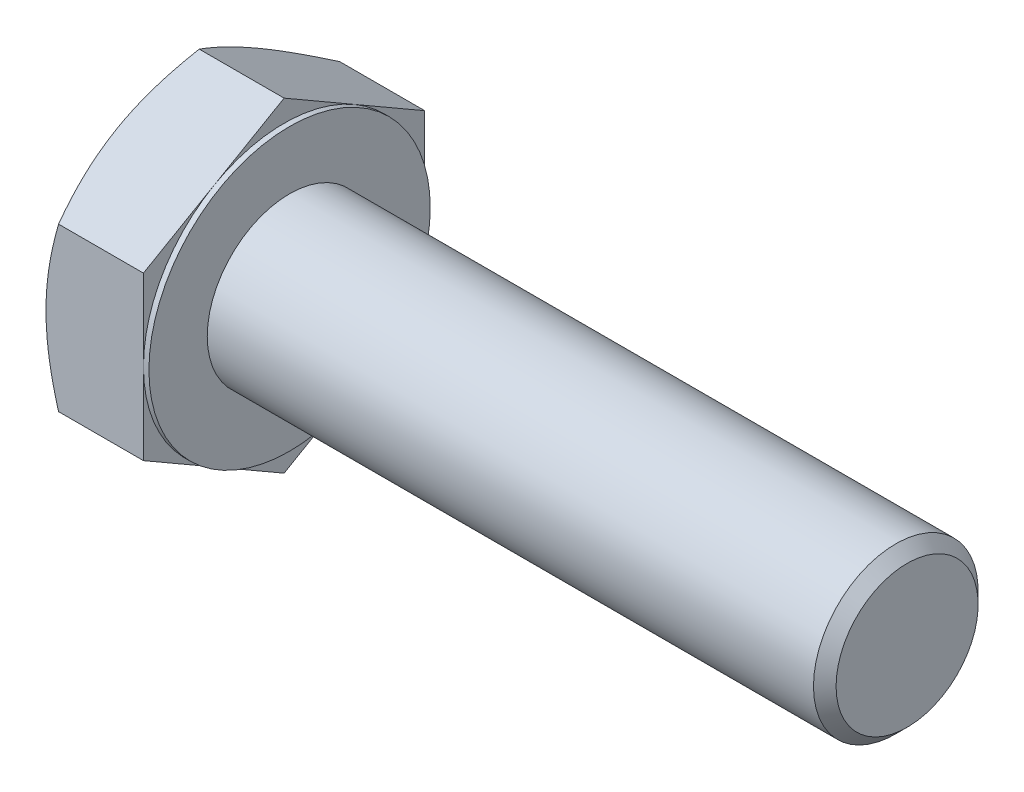
ISO-10303-21;
HEADER;
FILE_DESCRIPTION(('STEP AP214'),'2;1');
FILE_NAME('part.step','',(''),(''),'','','');
FILE_SCHEMA(('AUTOMOTIVE_DESIGN { 1 0 10303 214 1 1 1 1 }'));
ENDSEC;
DATA;
#1=APPLICATION_CONTEXT('core data for automotive mechanical design processes');
#2=APPLICATION_PROTOCOL_DEFINITION('international standard','automotive_design',2000,#1);
#3=PRODUCT_CONTEXT('',#1,'mechanical');
#4=PRODUCT('Part','Part','',(#3));
#5=PRODUCT_RELATED_PRODUCT_CATEGORY('part','',(#4));
#6=PRODUCT_DEFINITION_FORMATION('','',#4);
#7=PRODUCT_DEFINITION_CONTEXT('part definition',#1,'design');
#8=PRODUCT_DEFINITION('design','',#6,#7);
#9=PRODUCT_DEFINITION_SHAPE('','',#8);
#10=(LENGTH_UNIT() NAMED_UNIT(*) SI_UNIT(.MILLI.,.METRE.));
#11=(NAMED_UNIT(*) PLANE_ANGLE_UNIT() SI_UNIT($,.RADIAN.));
#12=(NAMED_UNIT(*) SI_UNIT($,.STERADIAN.) SOLID_ANGLE_UNIT());
#13=UNCERTAINTY_MEASURE_WITH_UNIT(LENGTH_MEASURE(1.E-05),#10,'distance_accuracy_value','');
#14=(GEOMETRIC_REPRESENTATION_CONTEXT(3) GLOBAL_UNCERTAINTY_ASSIGNED_CONTEXT((#13)) GLOBAL_UNIT_ASSIGNED_CONTEXT((#10,
#11,#12)) REPRESENTATION_CONTEXT('',''));
#15=CARTESIAN_POINT('',(0.,0.,0.));
#16=DIRECTION('',(0.,0.,1.));
#17=DIRECTION('',(1.,0.,0.));
#18=AXIS2_PLACEMENT_3D('',#15,#16,#17);
#19=CARTESIAN_POINT('',(15.,23.6713610367747,0.));
#20=DIRECTION('',(1.,0.,0.));
#21=DIRECTION('',(0.,0.,-1.));
#22=AXIS2_PLACEMENT_3D('',#19,#20,#21);
#23=PLANE('',#22);
#24=CARTESIAN_POINT('',(15.,0.,0.));
#25=DIRECTION('',(1.,0.,0.));
#26=DIRECTION('',(0.,0.,-1.));
#27=AXIS2_PLACEMENT_3D('',#24,#25,#26);
#28=CIRCLE('',#27,12.);
#29=CARTESIAN_POINT('',(15.,0.,-12.));
#30=VERTEX_POINT('',#29);
#31=EDGE_CURVE('E272',#30,#30,#28,.F.);
#32=ORIENTED_EDGE('',*,*,#31,.T.);
#33=EDGE_LOOP('',(#32));
#34=FACE_BOUND('',#33,.T.);
#35=CARTESIAN_POINT('',(15.,0.,0.));
#36=DIRECTION('',(1.,0.,0.));
#37=DIRECTION('',(0.,0.,-1.));
#38=AXIS2_PLACEMENT_3D('',#35,#36,#37);
#39=CIRCLE('',#38,20.5);
#40=CARTESIAN_POINT('',(15.,0.,-20.5));
#41=VERTEX_POINT('',#40);
#42=EDGE_CURVE('E291',#41,#41,#39,.T.);
#43=ORIENTED_EDGE('',*,*,#42,.T.);
#44=EDGE_LOOP('',(#43));
#45=FACE_BOUND('',#44,.T.);
#46=ADVANCED_FACE('F34',(#34,#45),#23,.T.);
#47=CARTESIAN_POINT('',(0.,0.,0.));
#48=DIRECTION('',(-1.,0.,0.));
#49=DIRECTION('',(0.,0.,1.));
#50=AXIS2_PLACEMENT_3D('',#47,#48,#49);
#51=CYLINDRICAL_SURFACE('',#50,12.);
#52=ORIENTED_EDGE('',*,*,#31,.F.);
#53=EDGE_LOOP('',(#52));
#54=FACE_BOUND('',#53,.T.);
#55=CARTESIAN_POINT('',(103.352,0.,0.));
#56=DIRECTION('',(-1.,0.,0.));
#57=DIRECTION('',(0.,0.,1.));
#58=AXIS2_PLACEMENT_3D('',#55,#56,#57);
#59=CIRCLE('',#58,12.);
#60=CARTESIAN_POINT('',(103.352,0.,12.));
#61=VERTEX_POINT('',#60);
#62=EDGE_CURVE('E269',#61,#61,#59,.T.);
#63=ORIENTED_EDGE('',*,*,#62,.T.);
#64=EDGE_LOOP('',(#63));
#65=FACE_BOUND('',#64,.T.);
#66=ADVANCED_FACE('F243',(#54,#65),#51,.T.);
#67=CARTESIAN_POINT('',(105.,0.,0.));
#68=DIRECTION('',(-1.,0.,0.));
#69=DIRECTION('',(0.,0.,1.));
#70=AXIS2_PLACEMENT_3D('',#67,#68,#69);
#71=CONICAL_SURFACE('',#70,10.352,0.785398163397449);
#72=ORIENTED_EDGE('',*,*,#62,.F.);
#73=EDGE_LOOP('',(#72));
#74=FACE_BOUND('',#73,.T.);
#75=CARTESIAN_POINT('',(105.,0.,0.));
#76=DIRECTION('',(-1.,0.,0.));
#77=DIRECTION('',(0.,0.,1.));
#78=AXIS2_PLACEMENT_3D('',#75,#76,#77);
#79=CIRCLE('',#78,10.352);
#80=CARTESIAN_POINT('',(105.,0.,10.352));
#81=VERTEX_POINT('',#80);
#82=EDGE_CURVE('E267',#81,#81,#79,.T.);
#83=ORIENTED_EDGE('',*,*,#82,.T.);
#84=EDGE_LOOP('',(#83));
#85=FACE_BOUND('',#84,.T.);
#86=ADVANCED_FACE('F248',(#74,#85),#71,.T.);
#87=CARTESIAN_POINT('',(105.,0.,0.));
#88=DIRECTION('',(-1.,0.,0.));
#89=DIRECTION('',(0.,0.,1.));
#90=AXIS2_PLACEMENT_3D('',#87,#88,#89);
#91=PLANE('',#90);
#92=ORIENTED_EDGE('',*,*,#82,.F.);
#93=EDGE_LOOP('',(#92));
#94=FACE_BOUND('',#93,.T.);
#95=ADVANCED_FACE('F255',(#94),#91,.F.);
#96=CARTESIAN_POINT('',(14.2,20.5,0.));
#97=DIRECTION('',(1.,0.,0.));
#98=DIRECTION('',(0.,0.,-1.));
#99=AXIS2_PLACEMENT_3D('',#96,#97,#98);
#100=PLANE('',#99);
#101=DIRECTION('',(0.,0.500000000000001,0.866025403784438));
#102=VECTOR('',#101,1.);
#103=CARTESIAN_POINT('',(14.2,11.8356805183873,-20.5));
#104=LINE('',#103,#102);
#105=CARTESIAN_POINT('',(14.2,11.8356805183873,-20.5));
#106=VERTEX_POINT('',#105);
#107=CARTESIAN_POINT('',(14.2,17.753520777581,-10.25));
#108=VERTEX_POINT('',#107);
#109=EDGE_CURVE('E167',#106,#108,#104,.T.);
#110=ORIENTED_EDGE('',*,*,#109,.T.);
#111=CARTESIAN_POINT('',(14.2,0.,0.));
#112=DIRECTION('',(-1.,0.,0.));
#113=DIRECTION('',(0.,0.,1.));
#114=AXIS2_PLACEMENT_3D('',#111,#112,#113);
#115=CIRCLE('',#114,20.5);
#116=CARTESIAN_POINT('',(14.2,0.,-20.5));
#117=VERTEX_POINT('',#116);
#118=EDGE_CURVE('E50',#108,#117,#115,.T.);
#119=ORIENTED_EDGE('',*,*,#118,.T.);
#120=DIRECTION('',(0.,1.,0.));
#121=VECTOR('',#120,1.);
#122=CARTESIAN_POINT('',(14.2,11.8356805183873,-20.5));
#123=LINE('',#122,#121);
#124=EDGE_CURVE('E39',#117,#106,#123,.T.);
#125=ORIENTED_EDGE('',*,*,#124,.T.);
#126=EDGE_LOOP('',(#110,#119,#125));
#127=FACE_BOUND('',#126,.T.);
#128=ADVANCED_FACE('F258',(#127),#100,.T.);
#129=CARTESIAN_POINT('',(14.2,23.6713610367747,0.));
#130=VERTEX_POINT('',#129);
#131=EDGE_CURVE('E165',#108,#130,#104,.T.);
#132=ORIENTED_EDGE('',*,*,#131,.T.);
#133=DIRECTION('',(0.,-0.500000000000001,0.866025403784438));
#134=VECTOR('',#133,1.);
#135=CARTESIAN_POINT('',(14.2,23.6713610367747,0.));
#136=LINE('',#135,#134);
#137=CARTESIAN_POINT('',(14.2,17.753520777581,10.25));
#138=VERTEX_POINT('',#137);
#139=EDGE_CURVE('E164',#130,#138,#136,.T.);
#140=ORIENTED_EDGE('',*,*,#139,.T.);
#141=EDGE_CURVE('E153',#138,#108,#115,.T.);
#142=ORIENTED_EDGE('',*,*,#141,.T.);
#143=EDGE_LOOP('',(#132,#140,#142));
#144=FACE_BOUND('',#143,.T.);
#145=ADVANCED_FACE('F263',(#144),#100,.T.);
#146=CARTESIAN_POINT('',(14.2,11.8356805183873,20.5));
#147=VERTEX_POINT('',#146);
#148=EDGE_CURVE('E132',#138,#147,#136,.T.);
#149=ORIENTED_EDGE('',*,*,#148,.T.);
#150=DIRECTION('',(0.,-1.,0.));
#151=VECTOR('',#150,1.);
#152=CARTESIAN_POINT('',(14.2,11.8356805183873,20.5));
#153=LINE('',#152,#151);
#154=CARTESIAN_POINT('',(14.2,0.,20.5));
#155=VERTEX_POINT('',#154);
#156=EDGE_CURVE('E126',#147,#155,#153,.T.);
#157=ORIENTED_EDGE('',*,*,#156,.T.);
#158=EDGE_CURVE('E130',#155,#138,#115,.T.);
#159=ORIENTED_EDGE('',*,*,#158,.T.);
#160=EDGE_LOOP('',(#149,#157,#159));
#161=FACE_BOUND('',#160,.T.);
#162=ADVANCED_FACE('F128',(#161),#100,.T.);
#163=CARTESIAN_POINT('',(14.2,-11.8356805183873,20.5));
#164=VERTEX_POINT('',#163);
#165=EDGE_CURVE('E136',#155,#164,#153,.T.);
#166=ORIENTED_EDGE('',*,*,#165,.T.);
#167=DIRECTION('',(0.,-0.500000000000002,-0.866025403784438));
#168=VECTOR('',#167,1.);
#169=CARTESIAN_POINT('',(14.2,-23.6713610367747,0.));
#170=LINE('',#169,#168);
#171=CARTESIAN_POINT('',(14.2,-17.753520777581,10.25));
#172=VERTEX_POINT('',#171);
#173=EDGE_CURVE('E143',#164,#172,#170,.T.);
#174=ORIENTED_EDGE('',*,*,#173,.T.);
#175=EDGE_CURVE('E140',#172,#155,#115,.T.);
#176=ORIENTED_EDGE('',*,*,#175,.T.);
#177=EDGE_LOOP('',(#166,#174,#176));
#178=FACE_BOUND('',#177,.T.);
#179=ADVANCED_FACE('F141',(#178),#100,.T.);
#180=CARTESIAN_POINT('',(14.2,-23.6713610367747,0.));
#181=VERTEX_POINT('',#180);
#182=EDGE_CURVE('E159',#172,#181,#170,.T.);
#183=ORIENTED_EDGE('',*,*,#182,.T.);
#184=DIRECTION('',(0.,0.5,-0.866025403784439));
#185=VECTOR('',#184,1.);
#186=CARTESIAN_POINT('',(14.2,-11.8356805183873,-20.5));
#187=LINE('',#186,#185);
#188=CARTESIAN_POINT('',(14.2,-17.753520777581,-10.25));
#189=VERTEX_POINT('',#188);
#190=EDGE_CURVE('E327',#181,#189,#187,.T.);
#191=ORIENTED_EDGE('',*,*,#190,.T.);
#192=EDGE_CURVE('E147',#189,#172,#115,.T.);
#193=ORIENTED_EDGE('',*,*,#192,.T.);
#194=EDGE_LOOP('',(#183,#191,#193));
#195=FACE_BOUND('',#194,.T.);
#196=ADVANCED_FACE('F332',(#195),#100,.T.);
#197=CARTESIAN_POINT('',(14.2,-11.8356805183873,-20.5));
#198=VERTEX_POINT('',#197);
#199=EDGE_CURVE('E154',#189,#198,#187,.T.);
#200=ORIENTED_EDGE('',*,*,#199,.T.);
#201=EDGE_CURVE('E11',#198,#117,#123,.T.);
#202=ORIENTED_EDGE('',*,*,#201,.T.);
#203=EDGE_CURVE('E345',#117,#189,#115,.T.);
#204=ORIENTED_EDGE('',*,*,#203,.T.);
#205=EDGE_LOOP('',(#200,#202,#204));
#206=FACE_BOUND('',#205,.T.);
#207=ADVANCED_FACE('F264',(#206),#100,.T.);
#208=CARTESIAN_POINT('',(0.,0.,0.));
#209=DIRECTION('',(-1.,0.,0.));
#210=DIRECTION('',(0.,0.,1.));
#211=AXIS2_PLACEMENT_3D('',#208,#209,#210);
#212=CYLINDRICAL_SURFACE('',#211,20.5);
#213=ORIENTED_EDGE('',*,*,#118,.F.);
#214=ORIENTED_EDGE('',*,*,#141,.F.);
#215=ORIENTED_EDGE('',*,*,#158,.F.);
#216=ORIENTED_EDGE('',*,*,#175,.F.);
#217=ORIENTED_EDGE('',*,*,#192,.F.);
#218=ORIENTED_EDGE('',*,*,#203,.F.);
#219=EDGE_LOOP('',(#213,#214,#215,#216,#217,#218));
#220=FACE_BOUND('',#219,.T.);
#221=ORIENTED_EDGE('',*,*,#42,.F.);
#222=EDGE_LOOP('',(#221));
#223=FACE_BOUND('',#222,.T.);
#224=ADVANCED_FACE('F150',(#220,#223),#212,.T.);
#225=CARTESIAN_POINT('',(0.,23.6713610367747,0.));
#226=DIRECTION('',(1.,0.,0.));
#227=DIRECTION('',(0.,0.,-1.));
#228=AXIS2_PLACEMENT_3D('',#225,#226,#227);
#229=PLANE('',#228);
#230=CARTESIAN_POINT('',(0.,0.,0.));
#231=DIRECTION('',(1.,0.,0.));
#232=DIRECTION('',(0.,0.,-1.));
#233=AXIS2_PLACEMENT_3D('',#230,#231,#232);
#234=CIRCLE('',#233,20.5);
#235=CARTESIAN_POINT('',(0.,0.,-20.5));
#236=VERTEX_POINT('',#235);
#237=CARTESIAN_POINT('',(0.,17.753520777581,-10.25));
#238=VERTEX_POINT('',#237);
#239=EDGE_CURVE('E290',#236,#238,#234,.T.);
#240=ORIENTED_EDGE('',*,*,#239,.F.);
#241=CARTESIAN_POINT('',(0.,-17.753520777581,-10.25));
#242=VERTEX_POINT('',#241);
#243=EDGE_CURVE('E287',#242,#236,#234,.T.);
#244=ORIENTED_EDGE('',*,*,#243,.F.);
#245=CARTESIAN_POINT('',(0.,-17.753520777581,10.25));
#246=VERTEX_POINT('',#245);
#247=EDGE_CURVE('E289',#246,#242,#234,.T.);
#248=ORIENTED_EDGE('',*,*,#247,.F.);
#249=CARTESIAN_POINT('',(0.,0.,20.5));
#250=VERTEX_POINT('',#249);
#251=EDGE_CURVE('E299',#250,#246,#234,.T.);
#252=ORIENTED_EDGE('',*,*,#251,.F.);
#253=CARTESIAN_POINT('',(0.,0.,0.));
#254=DIRECTION('',(-1.,0.,0.));
#255=DIRECTION('',(0.,0.,1.));
#256=AXIS2_PLACEMENT_3D('',#253,#254,#255);
#257=CIRCLE('',#256,20.5);
#258=CARTESIAN_POINT('',(0.,17.753520777581,10.25));
#259=VERTEX_POINT('',#258);
#260=EDGE_CURVE('E168',#250,#259,#257,.T.);
#261=ORIENTED_EDGE('',*,*,#260,.T.);
#262=EDGE_CURVE('E294',#238,#259,#234,.T.);
#263=ORIENTED_EDGE('',*,*,#262,.F.);
#264=EDGE_LOOP('',(#240,#244,#248,#252,#261,#263));
#265=FACE_BOUND('',#264,.T.);
#266=ADVANCED_FACE('F197',(#265),#229,.F.);
#267=CARTESIAN_POINT('',(0.,0.,0.));
#268=DIRECTION('',(1.,0.,0.));
#269=DIRECTION('',(0.,0.,-1.));
#270=AXIS2_PLACEMENT_3D('',#267,#268,#269);
#271=CONICAL_SURFACE('',#270,20.5,1.0471975511966);
#272=CARTESIAN_POINT('',(1.83105281543379,11.8355650483335,20.5002));
#273=CARTESIAN_POINT('',(1.68086967877724,12.0957082975324,20.0496186751414));
#274=CARTESIAN_POINT('',(1.5375016409762,12.3568662449135,19.5972798414769));
#275=CARTESIAN_POINT('',(1.26629011460653,12.8812763146902,18.688974956623));
#276=CARTESIAN_POINT('',(1.13845173202012,13.1445290956947,18.2330077646893));
#277=CARTESIAN_POINT('',(0.900017930659494,13.6736376118339,17.3165649320189));
#278=CARTESIAN_POINT('',(0.78946331024546,13.9394979771376,16.8560812715941));
#279=CARTESIAN_POINT('',(0.58797100639033,14.4730660430363,15.9319142721613));
#280=CARTESIAN_POINT('',(0.497032199485878,14.7407736369276,15.4682311179696));
#281=CARTESIAN_POINT('',(0.338639409756816,15.2711766031042,14.5495462320664));
#282=CARTESIAN_POINT('',(0.270661173157539,15.5338325986846,14.0946127028087));
#283=CARTESIAN_POINT('',(0.156677064296761,16.0603481064455,13.1826610923938));
#284=CARTESIAN_POINT('',(0.110671614976157,16.3242076416936,12.7256429712826));
#285=CARTESIAN_POINT('',(0.041794695836964,16.8523699515021,11.8108390160513));
#286=CARTESIAN_POINT('',(0.0188957361202555,17.1166718237643,11.3530547447576));
#287=CARTESIAN_POINT('',(-0.00327576649170823,17.6455194785583,10.4370637371908));
#288=CARTESIAN_POINT('',(-0.00254903945591466,17.9100652533005,9.97885701440963));
#289=CARTESIAN_POINT('',(0.0208807818136251,18.4046387706181,9.1222305543374));
#290=CARTESIAN_POINT('',(0.0407268159283953,18.6347017354273,8.72374981034796));
#291=CARTESIAN_POINT('',(0.0979103594641415,19.094278420957,7.92773964103654));
#292=CARTESIAN_POINT('',(0.135247618366443,19.3237921494965,7.53021020217141));
#293=CARTESIAN_POINT('',(0.22676651134495,19.7821855638441,6.73624951866641));
#294=CARTESIAN_POINT('',(0.280963377501391,20.0110644867084,6.33981959548387));
#295=CARTESIAN_POINT('',(0.405242283214538,20.4677264151912,5.54885793346923));
#296=CARTESIAN_POINT('',(0.475324255464145,20.6955094254491,5.15432618660155));
#297=CARTESIAN_POINT('',(0.711196385255139,21.387010187247,3.95661173369512));
#298=CARTESIAN_POINT('',(0.900518562282514,21.8487632520309,3.15683196493861));
#299=CARTESIAN_POINT('',(1.22283076676052,22.5362934498755,1.96599473053393));
#300=CARTESIAN_POINT('',(1.3365403402569,22.7644232692918,1.57086229258334));
#301=CARTESIAN_POINT('',(1.57547119415014,23.2191049585828,0.783330505460215));
#302=CARTESIAN_POINT('',(1.70068922992884,23.4456572539543,0.390930419305416));
#303=CARTESIAN_POINT('',(1.83105281543381,23.6714765068285,-0.000199999999998836));
#304=B_SPLINE_CURVE_WITH_KNOTS('',3,(#272,#273,#274,#275,#276,#277,#278,#279,#280,#281,#282,
#283,#284,#285,#286,#287,#288,#289,#290,#291,#292,#293,#294,#295,#296,#297,#298,#299,#300,#301,
#302,#303),.UNSPECIFIED.,.F.,.F.,(4,2,2,2,2,2,2,2,2,2,2,2,2,2,2,4),(0.,1.62462772683814,
3.24978817616179,4.87872871091944,6.50757592600936,8.09621981665212,9.68489428490839,
11.2716764634131,12.8584096080289,14.2397371832637,15.6210449749912,17.0036043735311,
18.3861579141107,21.2121645707587,22.6227063085638,24.0328515805767),.UNSPECIFIED.);
#305=CARTESIAN_POINT('',(1.83098614827934,23.6713610367747,0.));
#306=VERTEX_POINT('',#305);
#307=EDGE_CURVE('E215',#259,#306,#304,.T.);
#308=ORIENTED_EDGE('',*,*,#307,.T.);
#309=CARTESIAN_POINT('',(1.83105281543381,23.6714765068285,0.000199999999999164));
#310=CARTESIAN_POINT('',(1.68086967877726,23.4113332576296,-0.450381324858645));
#311=CARTESIAN_POINT('',(1.53750164097621,23.1501753102484,-0.902720158523133));
#312=CARTESIAN_POINT('',(1.26629011460654,22.6257652404718,-1.81102504337699));
#313=CARTESIAN_POINT('',(1.13845173202013,22.3625124594673,-2.26699223531068));
#314=CARTESIAN_POINT('',(0.9000179306595,21.8334039433281,-3.1834350679811));
#315=CARTESIAN_POINT('',(0.789463310245466,21.5675435780244,-3.6439187284059));
#316=CARTESIAN_POINT('',(0.587971006390336,21.0339755121257,-4.5680857278387));
#317=CARTESIAN_POINT('',(0.497032199485883,20.7662679182344,-5.03176888203041));
#318=CARTESIAN_POINT('',(0.338639409756821,20.2358649520577,-5.95045376793366));
#319=CARTESIAN_POINT('',(0.270661173157544,19.9732089564774,-6.40538729719136));
#320=CARTESIAN_POINT('',(0.156677064296765,19.4466934487165,-7.3173389076062));
#321=CARTESIAN_POINT('',(0.110671614976158,19.1828339134684,-7.77435702871746));
#322=CARTESIAN_POINT('',(0.0417946958369642,18.6546716036599,-8.6891609839487));
#323=CARTESIAN_POINT('',(0.0188957361202563,18.3903697313977,-9.14694525524243));
#324=CARTESIAN_POINT('',(-0.00327576649170902,17.8615220766037,-10.0629362628092));
#325=CARTESIAN_POINT('',(-0.00254903945591771,17.5969763018615,-10.5211429855904));
#326=CARTESIAN_POINT('',(0.0208807818136221,17.1024027845438,-11.3777694456626));
#327=CARTESIAN_POINT('',(0.0407268159283941,16.8723398197347,-11.7762501896521));
#328=CARTESIAN_POINT('',(0.0979103594641395,16.412763134205,-12.5722603589635));
#329=CARTESIAN_POINT('',(0.135247618366438,16.1832494056654,-12.9697897978286));
#330=CARTESIAN_POINT('',(0.226766511344943,15.7248559913179,-13.7637504813336));
#331=CARTESIAN_POINT('',(0.280963377501385,15.4959770684536,-14.1601804045161));
#332=CARTESIAN_POINT('',(0.40524228321453,15.0393151399708,-14.9511420665308));
#333=CARTESIAN_POINT('',(0.475324255464136,14.8115321297129,-15.3456738133985));
#334=CARTESIAN_POINT('',(0.711196385255127,14.120031367915,-16.5433882663049));
#335=CARTESIAN_POINT('',(0.900518562282503,13.658278303131,-17.3431680350614));
#336=CARTESIAN_POINT('',(1.22283076676051,12.9707481052865,-18.5340052694661));
#337=CARTESIAN_POINT('',(1.33654034025688,12.7426182858701,-18.9291377074167));
#338=CARTESIAN_POINT('',(1.57547119415012,12.2879365965792,-19.7166694945398));
#339=CARTESIAN_POINT('',(1.70068922992882,12.0613843012077,-20.1090695806946));
#340=CARTESIAN_POINT('',(1.83105281543379,11.8355650483335,-20.5002));
#341=B_SPLINE_CURVE_WITH_KNOTS('',3,(#309,#310,#311,#312,#313,#314,#315,#316,#317,#318,#319,
#320,#321,#322,#323,#324,#325,#326,#327,#328,#329,#330,#331,#332,#333,#334,#335,#336,#337,#338,
#339,#340),.UNSPECIFIED.,.F.,.F.,(4,2,2,2,2,2,2,2,2,2,2,2,2,2,2,4),(0.,1.62462772683814,
3.24978817616179,4.87872871091945,6.50757592600936,8.09621981665213,9.6848942849084,
11.2716764634131,12.8584096080289,14.2397371832637,15.6210449749912,17.0036043735311,
18.3861579141107,21.2121645707587,22.6227063085638,24.0328515805767),.UNSPECIFIED.);
#342=EDGE_CURVE('E58',#306,#238,#341,.T.);
#343=ORIENTED_EDGE('',*,*,#342,.T.);
#344=ORIENTED_EDGE('',*,*,#262,.T.);
#345=EDGE_LOOP('',(#308,#343,#344));
#346=FACE_BOUND('',#345,.T.);
#347=ADVANCED_FACE('F341',(#346),#271,.T.);
#348=CARTESIAN_POINT('',(10.0045735774101,-31.7921389168297,20.5));
#349=CARTESIAN_POINT('',(9.78736329925864,-31.3444790226063,20.5));
#350=CARTESIAN_POINT('',(9.57123614831936,-30.896293830728,20.5));
#351=CARTESIAN_POINT('',(9.14139340339292,-29.9987632315423,20.5));
#352=CARTESIAN_POINT('',(8.92767783367261,-29.5494178126156,20.5));
#353=CARTESIAN_POINT('',(8.29046013485941,-28.1993571494022,20.5));
#354=CARTESIAN_POINT('',(7.87095143624472,-27.2967499011084,20.5));
#355=CARTESIAN_POINT('',(7.04286118778807,-25.480583203283,20.5));
#356=CARTESIAN_POINT('',(6.63435156315197,-24.5669908803155,20.5));
#357=CARTESIAN_POINT('',(5.83404260418421,-22.7325410271718,20.5));
#358=CARTESIAN_POINT('',(5.44224248045818,-21.8116838426448,20.5));
#359=CARTESIAN_POINT('',(4.66751070129248,-19.9314771504444,20.5));
#360=CARTESIAN_POINT('',(4.28526901259515,-18.9718418554754,20.5));
#361=CARTESIAN_POINT('',(3.54971359584654,-17.0413372560874,20.5));
#362=CARTESIAN_POINT('',(3.19640311465207,-16.070466704688,20.5));
#363=CARTESIAN_POINT('',(2.52799067653959,-14.1177960437726,20.5));
#364=CARTESIAN_POINT('',(2.2128113654229,-13.1360226276231,20.5));
#365=CARTESIAN_POINT('',(1.63075735913315,-11.1582993399606,20.5));
#366=CARTESIAN_POINT('',(1.36386744879116,-10.1623540408247,20.5));
#367=CARTESIAN_POINT('',(1.01013936840319,-8.66039751953906,20.5));
#368=CARTESIAN_POINT('',(0.900235340348725,-8.15978559631494,20.5));
#369=CARTESIAN_POINT('',(0.697271023931701,-7.15514108313506,20.5));
#370=CARTESIAN_POINT('',(0.604210388747494,-6.65110856383444,20.5));
#371=CARTESIAN_POINT('',(0.436577049671513,-5.63997954032374,20.5));
#372=CARTESIAN_POINT('',(0.362003751843513,-5.13288313508236,20.5));
#373=CARTESIAN_POINT('',(0.232828040517381,-4.11613536757424,20.5));
#374=CARTESIAN_POINT('',(0.178225615047637,-3.60648400683928,20.5));
#375=CARTESIAN_POINT('',(0.0907657338733951,-2.59202077925911,20.5));
#376=CARTESIAN_POINT('',(0.0576332933337369,-2.08723276544726,20.5));
#377=CARTESIAN_POINT('',(0.0127447767670391,-1.07670899405524,20.5));
#378=CARTESIAN_POINT('',(0.000988346370062387,-0.570973252325565,20.5));
#379=CARTESIAN_POINT('',(-0.000868568251924008,0.440543542487557,20.5));
#380=CARTESIAN_POINT('',(0.00903105400039662,0.946324595781564,20.5));
#381=CARTESIAN_POINT('',(0.0502449494820021,1.957018825529,20.5));
#382=CARTESIAN_POINT('',(0.0815601843253848,2.46193196199013,20.5));
#383=CARTESIAN_POINT('',(0.181892931659689,3.67541240372944,20.5));
#384=CARTESIAN_POINT('',(0.261072303371068,4.38315427484418,20.5));
#385=CARTESIAN_POINT('',(0.457195893755737,5.79338947321695,20.5));
#386=CARTESIAN_POINT('',(0.574145248854967,6.49588207331286,20.5));
#387=CARTESIAN_POINT('',(0.84164846905036,7.89494840006496,20.5));
#388=CARTESIAN_POINT('',(0.992228587800671,8.59151705881758,20.5));
#389=CARTESIAN_POINT('',(1.32239799658934,9.97766865129423,20.5));
#390=CARTESIAN_POINT('',(1.50198684412328,10.6672516914077,20.5));
#391=CARTESIAN_POINT('',(1.89003635292229,12.0545545156174,20.5));
#392=CARTESIAN_POINT('',(2.09904485132713,12.7521199961336,20.5));
#393=CARTESIAN_POINT('',(2.538641668,14.1403793411594,20.5));
#394=CARTESIAN_POINT('',(2.76923012728724,14.8310731607321,20.5));
#395=CARTESIAN_POINT('',(3.2483270182559,16.2059303823508,20.5));
#396=CARTESIAN_POINT('',(3.49682946738404,16.8900958789531,20.5));
#397=CARTESIAN_POINT('',(4.00883234587368,18.2527591756487,20.5));
#398=CARTESIAN_POINT('',(4.27233260924537,18.9312570383738,20.5));
#399=CARTESIAN_POINT('',(4.90504075905595,20.5167699200849,20.5));
#400=CARTESIAN_POINT('',(5.27932054344789,21.421757765143,20.5));
#401=CARTESIAN_POINT('',(6.04577825988606,23.224144667096,20.5));
#402=CARTESIAN_POINT('',(6.43795725089847,24.121543271258,20.5));
#403=CARTESIAN_POINT('',(7.23667478358935,25.9101426428634,20.5));
#404=CARTESIAN_POINT('',(7.64321640353473,26.8013420320711,20.5));
#405=CARTESIAN_POINT('',(8.46779917840303,28.5783696709183,20.5));
#406=CARTESIAN_POINT('',(8.88584009832895,29.4641980298681,20.5));
#407=CARTESIAN_POINT('',(9.73174717385664,31.232304730248,20.5));
#408=CARTESIAN_POINT('',(10.1596233349035,32.1145782766106,20.5));
#409=CARTESIAN_POINT('',(11.023106586703,33.8753332789287,20.5));
#410=CARTESIAN_POINT('',(11.458713709275,34.753814719258,20.5));
#411=CARTESIAN_POINT('',(12.336294228428,36.5074549218932,20.5));
#412=CARTESIAN_POINT('',(12.7782668436227,37.3826140756343,20.5));
#413=CARTESIAN_POINT('',(13.6675972041087,39.1301871442554,20.5));
#414=CARTESIAN_POINT('',(14.1149549397483,40.002601064052,20.5));
#415=CARTESIAN_POINT('',(15.3896420293359,42.4725798310685,20.5));
#416=CARTESIAN_POINT('',(16.2223378269472,44.0673751924162,20.5));
#417=CARTESIAN_POINT('',(17.8991647654702,47.250997873102,20.5));
#418=CARTESIAN_POINT('',(18.7432962960686,48.8398249866963,20.5));
#419=CARTESIAN_POINT('',(20.4382614172959,52.0089141659128,20.5));
#420=CARTESIAN_POINT('',(21.2890736349352,53.589187670586,20.5));
#421=CARTESIAN_POINT('',(22.5704014911969,55.9567745219083,20.5));
#422=CARTESIAN_POINT('',(22.9983509772167,56.7454787459173,20.5));
#423=CARTESIAN_POINT('',(23.8557834890834,58.3220516345655,20.5));
#424=CARTESIAN_POINT('',(24.2852665125207,59.1099203005151,20.5));
#425=CARTESIAN_POINT('',(24.7154284836023,59.8974182066807,20.5));
#426=B_SPLINE_CURVE_WITH_KNOTS('',3,(#348,#349,#350,#351,#352,#353,#354,#355,#356,#357,#358,
#359,#360,#361,#362,#363,#364,#365,#366,#367,#368,#369,#370,#371,#372,#373,#374,#375,#376,#377,
#378,#379,#380,#381,#382,#383,#384,#385,#386,#387,#388,#389,#390,#391,#392,#393,#394,#395,#396,
#397,#398,#399,#400,#401,#402,#403,#404,#405,#406,#407,#408,#409,#410,#411,#412,#413,#414,#415,
#416,#417,#418,#419,#420,#421,#422,#423,#424,#425),.UNSPECIFIED.,.F.,.F.,(4,2,2,2,2,2,2,2,2,2,2,
2,2,2,2,2,2,2,2,2,2,2,2,2,2,2,2,2,2,2,2,2,2,2,2,2,2,2,4),(0.,1.49271869282053,2.9854523929492,
5.97136149576122,8.9735268072274,11.9755501321946,15.0740772307499,18.1729515918541,
21.2654301342086,24.3569325858678,25.8942973292462,27.4316304132049,28.9689141013985,
30.5061968680604,32.0233793638815,33.5405367077325,35.0577015110789,36.5749344433597,
38.7102245709997,40.8458052039615,42.9830588287241,45.1202798545096,47.3044767651091,
49.4886879498398,51.6721730451499,53.8556339792163,56.7933660988621,59.7312722486747,
62.6698119306349,65.6082916058346,68.5499059328189,71.4915323697898,74.4328007384971,
77.3740638364239,82.771288514405,88.168697574365,93.5529397785737,96.2449184678808,
98.9368929290924),.UNSPECIFIED.);
#427=CARTESIAN_POINT('',(1.83098614827932,11.8356805183873,20.5));
#428=VERTEX_POINT('',#427);
#429=EDGE_CURVE('E227',#250,#428,#426,.T.);
#430=ORIENTED_EDGE('',*,*,#429,.T.);
#431=EDGE_CURVE('E226',#428,#259,#304,.T.);
#432=ORIENTED_EDGE('',*,*,#431,.T.);
#433=ORIENTED_EDGE('',*,*,#260,.F.);
#434=EDGE_LOOP('',(#430,#432,#433));
#435=FACE_BOUND('',#434,.T.);
#436=ADVANCED_FACE('F337',(#435),#271,.T.);
#437=CARTESIAN_POINT('',(1.83098614827931,-11.8356805183873,20.5));
#438=VERTEX_POINT('',#437);
#439=EDGE_CURVE('E270',#438,#250,#426,.T.);
#440=ORIENTED_EDGE('',*,*,#439,.T.);
#441=ORIENTED_EDGE('',*,*,#251,.T.);
#442=CARTESIAN_POINT('',(1.8310528154338,-23.6714765068285,-0.000200000000000067));
#443=CARTESIAN_POINT('',(1.68086967877725,-23.4113332576296,0.450381324858642));
#444=CARTESIAN_POINT('',(1.5375016409762,-23.1501753102484,0.90272015852313));
#445=CARTESIAN_POINT('',(1.26629011460653,-22.6257652404718,1.81102504337698));
#446=CARTESIAN_POINT('',(1.13845173202013,-22.3625124594673,2.26699223531068));
#447=CARTESIAN_POINT('',(0.900017930659496,-21.8334039433281,3.18343506798109));
#448=CARTESIAN_POINT('',(0.789463310245462,-21.5675435780244,3.64391872840589));
#449=CARTESIAN_POINT('',(0.587971006390332,-21.0339755121257,4.56808572783869));
#450=CARTESIAN_POINT('',(0.497032199485879,-20.7662679182344,5.0317688820304));
#451=CARTESIAN_POINT('',(0.338639409756816,-20.2358649520577,5.95045376793365));
#452=CARTESIAN_POINT('',(0.270661173157538,-19.9732089564774,6.40538729719135));
#453=CARTESIAN_POINT('',(0.156677064296758,-19.4466934487165,7.31733890760619));
#454=CARTESIAN_POINT('',(0.110671614976152,-19.1828339134684,7.77435702871744));
#455=CARTESIAN_POINT('',(0.0417946958369573,-18.6546716036599,8.68916098394868));
#456=CARTESIAN_POINT('',(0.0188957361202477,-18.3903697313977,9.14694525524242));
#457=CARTESIAN_POINT('',(-0.00327576649171848,-17.8615220766037,10.0629362628092));
#458=CARTESIAN_POINT('',(-0.00254903945592618,-17.5969763018615,10.5211429855904));
#459=CARTESIAN_POINT('',(0.0208807818136135,-17.1024027845438,11.3777694456626));
#460=CARTESIAN_POINT('',(0.0407268159283846,-16.8723398197347,11.776250189652));
#461=CARTESIAN_POINT('',(0.0979103594641292,-16.412763134205,12.5722603589635));
#462=CARTESIAN_POINT('',(0.135247618366428,-16.1832494056654,12.9697897978286));
#463=CARTESIAN_POINT('',(0.226766511344933,-15.7248559913178,13.7637504813336));
#464=CARTESIAN_POINT('',(0.280963377501374,-15.4959770684536,14.1601804045161));
#465=CARTESIAN_POINT('',(0.40524228321452,-15.0393151399707,14.9511420665308));
#466=CARTESIAN_POINT('',(0.475324255464126,-14.8115321297128,15.3456738133985));
#467=CARTESIAN_POINT('',(0.711196385255118,-14.120031367915,16.5433882663049));
#468=CARTESIAN_POINT('',(0.900518562282493,-13.658278303131,17.3431680350614));
#469=CARTESIAN_POINT('',(1.2228307667605,-12.9707481052864,18.5340052694661));
#470=CARTESIAN_POINT('',(1.33654034025688,-12.7426182858701,18.9291377074167));
#471=CARTESIAN_POINT('',(1.57547119415012,-12.2879365965792,19.7166694945398));
#472=CARTESIAN_POINT('',(1.70068922992882,-12.0613843012077,20.1090695806946));
#473=CARTESIAN_POINT('',(1.83105281543378,-11.8355650483334,20.5002));
#474=B_SPLINE_CURVE_WITH_KNOTS('',3,(#442,#443,#444,#445,#446,#447,#448,#449,#450,#451,#452,
#453,#454,#455,#456,#457,#458,#459,#460,#461,#462,#463,#464,#465,#466,#467,#468,#469,#470,#471,
#472,#473),.UNSPECIFIED.,.F.,.F.,(4,2,2,2,2,2,2,2,2,2,2,2,2,2,2,4),(0.,1.62462772683814,
3.24978817616179,4.87872871091945,6.50757592600936,8.09621981665213,9.68489428490839,
11.2716764634131,12.8584096080289,14.2397371832637,15.6210449749912,17.0036043735311,
18.3861579141107,21.2121645707587,22.6227063085638,24.0328515805767),.UNSPECIFIED.);
#475=EDGE_CURVE('E217',#246,#438,#474,.T.);
#476=ORIENTED_EDGE('',*,*,#475,.T.);
#477=EDGE_LOOP('',(#440,#441,#476));
#478=FACE_BOUND('',#477,.T.);
#479=ADVANCED_FACE('F186',(#478),#271,.T.);
#480=CARTESIAN_POINT('',(1.83098614827933,-23.6713610367747,0.));
#481=VERTEX_POINT('',#480);
#482=EDGE_CURVE('E210',#481,#246,#474,.T.);
#483=ORIENTED_EDGE('',*,*,#482,.T.);
#484=ORIENTED_EDGE('',*,*,#247,.T.);
#485=CARTESIAN_POINT('',(1.83105281543381,-11.8355650483335,-20.5002));
#486=CARTESIAN_POINT('',(1.68086967877726,-12.0957082975325,-20.0496186751414));
#487=CARTESIAN_POINT('',(1.53750164097621,-12.3568662449136,-19.5972798414769));
#488=CARTESIAN_POINT('',(1.26629011460654,-12.8812763146902,-18.688974956623));
#489=CARTESIAN_POINT('',(1.13845173202013,-13.1445290956948,-18.2330077646893));
#490=CARTESIAN_POINT('',(0.900017930659504,-13.6736376118339,-17.3165649320189));
#491=CARTESIAN_POINT('',(0.78946331024547,-13.9394979771376,-16.8560812715941));
#492=CARTESIAN_POINT('',(0.58797100639034,-14.4730660430363,-15.9319142721613));
#493=CARTESIAN_POINT('',(0.497032199485888,-14.7407736369276,-15.4682311179696));
#494=CARTESIAN_POINT('',(0.338639409756825,-15.2711766031043,-14.5495462320663));
#495=CARTESIAN_POINT('',(0.270661173157548,-15.5338325986846,-14.0946127028086));
#496=CARTESIAN_POINT('',(0.15667706429677,-16.0603481064455,-13.1826610923938));
#497=CARTESIAN_POINT('',(0.110671614976165,-16.3242076416936,-12.7256429712825));
#498=CARTESIAN_POINT('',(0.0417946958369722,-16.8523699515021,-11.8108390160513));
#499=CARTESIAN_POINT('',(0.0188957361202635,-17.1166718237643,-11.3530547447576));
#500=CARTESIAN_POINT('',(-0.00327576649170024,-17.6455194785583,-10.4370637371908));
#501=CARTESIAN_POINT('',(-0.00254903945590657,-17.9100652533005,-9.97885701440961));
#502=CARTESIAN_POINT('',(0.020880781813634,-18.4046387706182,-9.12223055433739));
#503=CARTESIAN_POINT('',(0.0407268159284048,-18.6347017354273,-8.72374981034795));
#504=CARTESIAN_POINT('',(0.0979103594641499,-19.094278420957,-7.92773964103652));
#505=CARTESIAN_POINT('',(0.13524761836645,-19.3237921494966,-7.53021020217139));
#506=CARTESIAN_POINT('',(0.226766511344955,-19.7821855638441,-6.7362495186664));
#507=CARTESIAN_POINT('',(0.280963377501397,-20.0110644867084,-6.33981959548386));
#508=CARTESIAN_POINT('',(0.405242283214544,-20.4677264151912,-5.54885793346921));
#509=CARTESIAN_POINT('',(0.475324255464149,-20.6955094254491,-5.15432618660154));
#510=CARTESIAN_POINT('',(0.711196385255141,-21.387010187247,-3.95661173369511));
#511=CARTESIAN_POINT('',(0.900518562282516,-21.848763252031,-3.1568319649386));
#512=CARTESIAN_POINT('',(1.22283076676052,-22.5362934498755,-1.96599473053392));
#513=CARTESIAN_POINT('',(1.3365403402569,-22.7644232692918,-1.57086229258334));
#514=CARTESIAN_POINT('',(1.57547119415013,-23.2191049585828,-0.783330505460211));
#515=CARTESIAN_POINT('',(1.70068922992883,-23.4456572539543,-0.390930419305413));
#516=CARTESIAN_POINT('',(1.8310528154338,-23.6714765068285,0.00020000000000029));
#517=B_SPLINE_CURVE_WITH_KNOTS('',3,(#485,#486,#487,#488,#489,#490,#491,#492,#493,#494,#495,
#496,#497,#498,#499,#500,#501,#502,#503,#504,#505,#506,#507,#508,#509,#510,#511,#512,#513,#514,
#515,#516),.UNSPECIFIED.,.F.,.F.,(4,2,2,2,2,2,2,2,2,2,2,2,2,2,2,4),(0.,1.62462772683814,
3.2497881761618,4.87872871091945,6.50757592600936,8.09621981665213,9.6848942849084,
11.2716764634131,12.8584096080289,14.2397371832637,15.6210449749912,17.0036043735311,
18.3861579141107,21.2121645707586,22.6227063085638,24.0328515805766),.UNSPECIFIED.);
#518=EDGE_CURVE('E216',#242,#481,#517,.T.);
#519=ORIENTED_EDGE('',*,*,#518,.T.);
#520=EDGE_LOOP('',(#483,#484,#519));
#521=FACE_BOUND('',#520,.T.);
#522=ADVANCED_FACE('F308',(#521),#271,.T.);
#523=CARTESIAN_POINT('',(1.83098614827932,11.8356805183873,-20.5));
#524=VERTEX_POINT('',#523);
#525=EDGE_CURVE('E218',#238,#524,#341,.T.);
#526=ORIENTED_EDGE('',*,*,#525,.T.);
#527=CARTESIAN_POINT('',(10.0045735777148,-31.7921389174576,-20.5));
#528=CARTESIAN_POINT('',(9.78736329955696,-31.3444790232237,-20.5));
#529=CARTESIAN_POINT('',(9.57123614861131,-30.8962938313349,-20.5));
#530=CARTESIAN_POINT('',(9.14139340367213,-29.998763232128,-20.5));
#531=CARTESIAN_POINT('',(8.92767783394547,-29.5494178131908,-20.5));
#532=CARTESIAN_POINT('',(8.2904601351132,-28.1993571499457,-20.5));
#533=CARTESIAN_POINT('',(7.87095143648583,-27.2967499016307,-20.5));
#534=CARTESIAN_POINT('',(7.0428611880038,-25.4805832037627,-20.5));
#535=CARTESIAN_POINT('',(6.63435156335501,-24.5669908807737,-20.5));
#536=CARTESIAN_POINT('',(5.83404260436208,-22.7325410275867,-20.5));
#537=CARTESIAN_POINT('',(5.44224248062358,-21.8116838430381,-20.5));
#538=CARTESIAN_POINT('',(4.66751070143261,-19.9314771507928,-20.5));
#539=CARTESIAN_POINT('',(4.2852690127225,-18.9718418558005,-20.5));
#540=CARTESIAN_POINT('',(3.54971359594906,-17.0413372563656,-20.5));
#541=CARTESIAN_POINT('',(3.19640311474251,-16.0704667049425,-20.5));
#542=CARTESIAN_POINT('',(2.52799067660706,-14.1177960439794,-20.5));
#543=CARTESIAN_POINT('',(2.21281136547947,-13.1360226278058,-20.5));
#544=CARTESIAN_POINT('',(1.63075735916973,-11.1582993400944,-20.5));
#545=CARTESIAN_POINT('',(1.36386744881865,-10.1623540409337,-20.5));
#546=CARTESIAN_POINT('',(1.01013936841766,-8.66039751960431,-20.5));
#547=CARTESIAN_POINT('',(0.900235340358437,-8.15978559636141,-20.5));
#548=CARTESIAN_POINT('',(0.697271023933129,-7.15514108314371,-20.5));
#549=CARTESIAN_POINT('',(0.604210388745403,-6.65110856382404,-20.5));
#550=CARTESIAN_POINT('',(0.436577049663814,-5.63997954027505,-20.5));
#551=CARTESIAN_POINT('',(0.362003751833725,-5.13288313501442,-20.5));
#552=CARTESIAN_POINT('',(0.232828040505,-4.11613536746765,-20.5));
#553=CARTESIAN_POINT('',(0.178225615034752,-3.60648400671328,-20.5));
#554=CARTESIAN_POINT('',(0.090765733861215,-2.5920207790947,-20.5));
#555=CARTESIAN_POINT('',(0.0576332933227346,-2.08723276526385,-20.5));
#556=CARTESIAN_POINT('',(0.0127447767600604,-1.07670899383388,-20.5));
#557=CARTESIAN_POINT('',(0.000988346365929415,-0.570973252085249,-20.5));
#558=CARTESIAN_POINT('',(-0.000868568248742528,0.440543542765636,-20.5));
#559=CARTESIAN_POINT('',(0.00903105400804724,0.946324596078453,-20.5));
#560=CARTESIAN_POINT('',(0.0502449495000926,1.95701882586325,-20.5));
#561=CARTESIAN_POINT('',(0.0815601843494459,2.46193196234294,-20.5));
#562=CARTESIAN_POINT('',(0.181892931698446,3.67541240411128,-20.5));
#563=CARTESIAN_POINT('',(0.261072303418315,4.38315427523641,-20.5));
#564=CARTESIAN_POINT('',(0.45719589382042,5.79338947362951,-20.5));
#565=CARTESIAN_POINT('',(0.574145248928598,6.49588207373536,-20.5));
#566=CARTESIAN_POINT('',(0.84164846914203,7.89494840050697,-20.5));
#567=CARTESIAN_POINT('',(0.992228587901433,8.59151705926917,-20.5));
#568=CARTESIAN_POINT('',(1.32239799670821,9.97766865176471,-20.5));
#569=CARTESIAN_POINT('',(1.50198684425116,10.6672516918875,-20.5));
#570=CARTESIAN_POINT('',(1.89003635306824,12.0545545161161,-20.5));
#571=CARTESIAN_POINT('',(2.09904485148213,12.7521199966418,-20.5));
#572=CARTESIAN_POINT('',(2.53864166817286,14.1403793416866,-20.5));
#573=CARTESIAN_POINT('',(2.76923012746889,14.8310731612688,-20.5));
#574=CARTESIAN_POINT('',(3.24832701845483,16.2059303829063,-20.5));
#575=CARTESIAN_POINT('',(3.49682946759146,16.890095879518,-20.5));
#576=CARTESIAN_POINT('',(4.0088323460978,18.2527591762323,-20.5));
#577=CARTESIAN_POINT('',(4.27233260947769,18.9312570389668,-20.5));
#578=CARTESIAN_POINT('',(4.90504075930104,20.5167699206845,-20.5));
#579=CARTESIAN_POINT('',(5.27932054369705,21.4217577657399,-20.5));
#580=CARTESIAN_POINT('',(6.04577826014241,23.2241446676879,-20.5));
#581=CARTESIAN_POINT('',(6.43795725115796,24.1215432718475,-20.5));
#582=CARTESIAN_POINT('',(7.23667478385436,25.9101426434484,-20.5));
#583=CARTESIAN_POINT('',(7.64321640380215,26.801342032654,-20.5));
#584=CARTESIAN_POINT('',(8.4677991786747,28.5783696714972,-20.5));
#585=CARTESIAN_POINT('',(8.88584009860247,29.4641980304451,-20.5));
#586=CARTESIAN_POINT('',(9.73174717413341,31.2323047308212,-20.5));
#587=CARTESIAN_POINT('',(10.1596233351817,32.1145782771821,-20.5));
#588=CARTESIAN_POINT('',(11.0231065869836,33.8753332794967,-20.5));
#589=CARTESIAN_POINT('',(11.4587137095566,34.7538147198243,-20.5));
#590=CARTESIAN_POINT('',(12.3362942287115,36.5074549224562,-20.5));
#591=CARTESIAN_POINT('',(12.778266843907,37.3826140761959,-20.5));
#592=CARTESIAN_POINT('',(13.6675972043944,39.130187144814,-20.5));
#593=CARTESIAN_POINT('',(14.1149549400346,40.0026010646092,-20.5));
#594=CARTESIAN_POINT('',(15.3896420296247,42.4725798316237,-20.5));
#595=CARTESIAN_POINT('',(16.2223378272376,44.0673751929709,-20.5));
#596=CARTESIAN_POINT('',(17.8991647657637,47.2509978736559,-20.5));
#597=CARTESIAN_POINT('',(18.7432962963634,48.83982498725,-20.5));
#598=CARTESIAN_POINT('',(20.4382614175933,52.0089141664664,-20.5));
#599=CARTESIAN_POINT('',(21.2890736352339,53.5891876711398,-20.5));
#600=CARTESIAN_POINT('',(22.5704014914973,55.9567745224624,-20.5));
#601=CARTESIAN_POINT('',(22.9983509775177,56.7454787464716,-20.5));
#602=CARTESIAN_POINT('',(23.8557834893855,58.3220516351201,-20.5));
#603=CARTESIAN_POINT('',(24.2852665128233,59.1099203010699,-20.5));
#604=CARTESIAN_POINT('',(24.7154284839054,59.8974182072356,-20.5));
#605=B_SPLINE_CURVE_WITH_KNOTS('',3,(#527,#528,#529,#530,#531,#532,#533,#534,#535,#536,#537,
#538,#539,#540,#541,#542,#543,#544,#545,#546,#547,#548,#549,#550,#551,#552,#553,#554,#555,#556,
#557,#558,#559,#560,#561,#562,#563,#564,#565,#566,#567,#568,#569,#570,#571,#572,#573,#574,#575,
#576,#577,#578,#579,#580,#581,#582,#583,#584,#585,#586,#587,#588,#589,#590,#591,#592,#593,#594,
#595,#596,#597,#598,#599,#600,#601,#602,#603,#604),.UNSPECIFIED.,.F.,.F.,(4,2,2,2,2,2,2,2,2,2,2,
2,2,2,2,2,2,2,2,2,2,2,2,2,2,2,2,2,2,2,2,2,2,2,2,2,2,2,4),(0.,1.49271869285733,2.98545239302282,
5.97136149590846,8.97352680744908,11.9755501324907,15.0740772311251,18.1729515923083,
21.2654301347416,24.3569325864795,25.894297329916,27.4316304139327,28.9689141021844,
30.5061968689043,32.0233793647819,33.5405367086895,35.0577015120926,36.57493444443,
38.7102245721038,40.8458052050994,42.9830588298959,45.1202798557152,47.3044767663499,
49.4886879511159,51.6721730464612,53.8556339805627,56.7933661002059,59.7312722500157,
62.6698119319732,65.60829160717,68.5499059341513,71.4915323711191,74.4328007398234,
77.3740638377472,82.7712885157294,88.1686975756905,93.5529397799015,96.2449184692098,
98.9368929304226),.UNSPECIFIED.);
#606=EDGE_CURVE('E179',#524,#236,#605,.F.);
#607=ORIENTED_EDGE('',*,*,#606,.T.);
#608=ORIENTED_EDGE('',*,*,#239,.T.);
#609=EDGE_LOOP('',(#526,#607,#608));
#610=FACE_BOUND('',#609,.T.);
#611=ADVANCED_FACE('F322',(#610),#271,.T.);
#612=CARTESIAN_POINT('',(1.83098614827934,-11.8356805183873,-20.5));
#613=VERTEX_POINT('',#612);
#614=EDGE_CURVE('E180',#613,#242,#517,.T.);
#615=ORIENTED_EDGE('',*,*,#614,.T.);
#616=ORIENTED_EDGE('',*,*,#243,.T.);
#617=EDGE_CURVE('E171',#236,#613,#605,.F.);
#618=ORIENTED_EDGE('',*,*,#617,.T.);
#619=EDGE_LOOP('',(#615,#616,#618));
#620=FACE_BOUND('',#619,.T.);
#621=ADVANCED_FACE('F195',(#620),#271,.T.);
#622=CARTESIAN_POINT('',(15.,11.8356805183873,-20.5));
#623=DIRECTION('',(0.,0.,1.));
#624=DIRECTION('',(0.,-1.,0.));
#625=AXIS2_PLACEMENT_3D('',#622,#623,#624);
#626=PLANE('',#625);
#627=ORIENTED_EDGE('',*,*,#201,.F.);
#628=DIRECTION('',(-1.,0.,0.));
#629=VECTOR('',#628,1.);
#630=CARTESIAN_POINT('',(15.,-11.8356805183873,-20.5));
#631=LINE('',#630,#629);
#632=EDGE_CURVE('E278',#198,#613,#631,.T.);
#633=ORIENTED_EDGE('',*,*,#632,.T.);
#634=ORIENTED_EDGE('',*,*,#617,.F.);
#635=ORIENTED_EDGE('',*,*,#606,.F.);
#636=DIRECTION('',(-1.,0.,0.));
#637=VECTOR('',#636,1.);
#638=CARTESIAN_POINT('',(15.,11.8356805183873,-20.5));
#639=LINE('',#638,#637);
#640=EDGE_CURVE('E276',#106,#524,#639,.T.);
#641=ORIENTED_EDGE('',*,*,#640,.F.);
#642=ORIENTED_EDGE('',*,*,#124,.F.);
#643=EDGE_LOOP('',(#627,#633,#634,#635,#641,#642));
#644=FACE_BOUND('',#643,.T.);
#645=ADVANCED_FACE('F190',(#644),#626,.F.);
#646=CARTESIAN_POINT('',(15.,-11.8356805183873,-20.5));
#647=DIRECTION('',(0.,0.866025403784439,0.5));
#648=DIRECTION('',(0.,-0.5,0.866025403784439));
#649=AXIS2_PLACEMENT_3D('',#646,#647,#648);
#650=PLANE('',#649);
#651=ORIENTED_EDGE('',*,*,#190,.F.);
#652=DIRECTION('',(-1.,0.,0.));
#653=VECTOR('',#652,1.);
#654=CARTESIAN_POINT('',(15.,-23.6713610367747,0.));
#655=LINE('',#654,#653);
#656=EDGE_CURVE('E280',#181,#481,#655,.T.);
#657=ORIENTED_EDGE('',*,*,#656,.T.);
#658=ORIENTED_EDGE('',*,*,#518,.F.);
#659=ORIENTED_EDGE('',*,*,#614,.F.);
#660=ORIENTED_EDGE('',*,*,#632,.F.);
#661=ORIENTED_EDGE('',*,*,#199,.F.);
#662=EDGE_LOOP('',(#651,#657,#658,#659,#660,#661));
#663=FACE_BOUND('',#662,.T.);
#664=ADVANCED_FACE('F194',(#663),#650,.F.);
#665=CARTESIAN_POINT('',(15.,-23.6713610367747,0.));
#666=DIRECTION('',(0.,0.866025403784438,-0.500000000000002));
#667=DIRECTION('',(0.,0.500000000000002,0.866025403784438));
#668=AXIS2_PLACEMENT_3D('',#665,#666,#667);
#669=PLANE('',#668);
#670=ORIENTED_EDGE('',*,*,#173,.F.);
#671=DIRECTION('',(-1.,0.,0.));
#672=VECTOR('',#671,1.);
#673=CARTESIAN_POINT('',(15.,-11.8356805183873,20.5));
#674=LINE('',#673,#672);
#675=EDGE_CURVE('E158',#164,#438,#674,.T.);
#676=ORIENTED_EDGE('',*,*,#675,.T.);
#677=ORIENTED_EDGE('',*,*,#475,.F.);
#678=ORIENTED_EDGE('',*,*,#482,.F.);
#679=ORIENTED_EDGE('',*,*,#656,.F.);
#680=ORIENTED_EDGE('',*,*,#182,.F.);
#681=EDGE_LOOP('',(#670,#676,#677,#678,#679,#680));
#682=FACE_BOUND('',#681,.T.);
#683=ADVANCED_FACE('F202',(#682),#669,.F.);
#684=CARTESIAN_POINT('',(15.,11.8356805183873,20.5));
#685=DIRECTION('',(0.,0.,-1.));
#686=DIRECTION('',(0.,1.,0.));
#687=AXIS2_PLACEMENT_3D('',#684,#685,#686);
#688=PLANE('',#687);
#689=ORIENTED_EDGE('',*,*,#156,.F.);
#690=DIRECTION('',(-1.,0.,0.));
#691=VECTOR('',#690,1.);
#692=CARTESIAN_POINT('',(15.,11.8356805183873,20.5));
#693=LINE('',#692,#691);
#694=EDGE_CURVE('E283',#147,#428,#693,.T.);
#695=ORIENTED_EDGE('',*,*,#694,.T.);
#696=ORIENTED_EDGE('',*,*,#429,.F.);
#697=ORIENTED_EDGE('',*,*,#439,.F.);
#698=ORIENTED_EDGE('',*,*,#675,.F.);
#699=ORIENTED_EDGE('',*,*,#165,.F.);
#700=EDGE_LOOP('',(#689,#695,#696,#697,#698,#699));
#701=FACE_BOUND('',#700,.T.);
#702=ADVANCED_FACE('F156',(#701),#688,.F.);
#703=CARTESIAN_POINT('',(15.,23.6713610367747,0.));
#704=DIRECTION('',(0.,-0.866025403784438,-0.500000000000001));
#705=DIRECTION('',(0.,0.500000000000001,-0.866025403784438));
#706=AXIS2_PLACEMENT_3D('',#703,#704,#705);
#707=PLANE('',#706);
#708=ORIENTED_EDGE('',*,*,#139,.F.);
#709=DIRECTION('',(-1.,0.,0.));
#710=VECTOR('',#709,1.);
#711=CARTESIAN_POINT('',(15.,23.6713610367747,0.));
#712=LINE('',#711,#710);
#713=EDGE_CURVE('E285',#130,#306,#712,.T.);
#714=ORIENTED_EDGE('',*,*,#713,.T.);
#715=ORIENTED_EDGE('',*,*,#307,.F.);
#716=ORIENTED_EDGE('',*,*,#431,.F.);
#717=ORIENTED_EDGE('',*,*,#694,.F.);
#718=ORIENTED_EDGE('',*,*,#148,.F.);
#719=EDGE_LOOP('',(#708,#714,#715,#716,#717,#718));
#720=FACE_BOUND('',#719,.T.);
#721=ADVANCED_FACE('F232',(#720),#707,.F.);
#722=CARTESIAN_POINT('',(15.,11.8356805183873,-20.5));
#723=DIRECTION('',(0.,-0.866025403784438,0.500000000000001));
#724=DIRECTION('',(0.,-0.500000000000001,-0.866025403784438));
#725=AXIS2_PLACEMENT_3D('',#722,#723,#724);
#726=PLANE('',#725);
#727=ORIENTED_EDGE('',*,*,#109,.F.);
#728=ORIENTED_EDGE('',*,*,#640,.T.);
#729=ORIENTED_EDGE('',*,*,#525,.F.);
#730=ORIENTED_EDGE('',*,*,#342,.F.);
#731=ORIENTED_EDGE('',*,*,#713,.F.);
#732=ORIENTED_EDGE('',*,*,#131,.F.);
#733=EDGE_LOOP('',(#727,#728,#729,#730,#731,#732));
#734=FACE_BOUND('',#733,.T.);
#735=ADVANCED_FACE('F36',(#734),#726,.F.);
#736=CLOSED_SHELL('',(#46,#66,#86,#95,#128,#145,#162,#179,#196,#207,#224,#266,#347,#436,#479,
#522,#611,#621,#645,#664,#683,#702,#721,#735));
#737=MANIFOLD_SOLID_BREP('B2',#736);
#738=ADVANCED_BREP_SHAPE_REPRESENTATION('',(#18,#737),#14);
#739=SHAPE_DEFINITION_REPRESENTATION(#9,#738);
ENDSEC;
END-ISO-10303-21;
